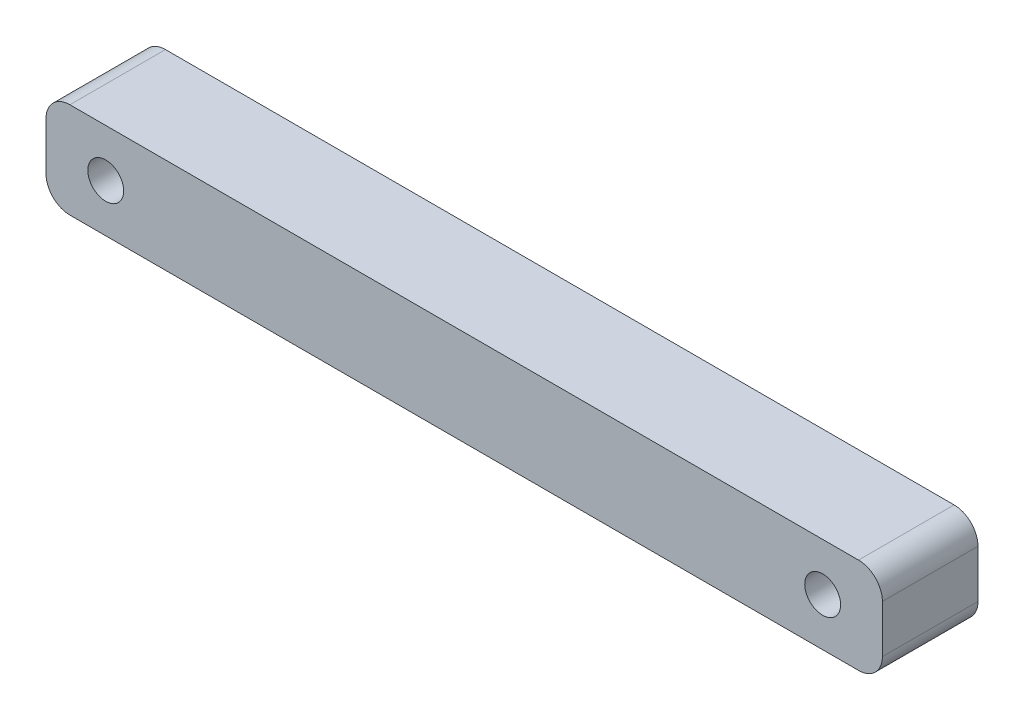
ISO-10303-21;
HEADER;
FILE_DESCRIPTION(('STEP AP214'),'2;1');
FILE_NAME('part.step','',(''),(''),'','','');
FILE_SCHEMA(('AUTOMOTIVE_DESIGN { 1 0 10303 214 1 1 1 1 }'));
ENDSEC;
DATA;
#1=APPLICATION_CONTEXT('core data for automotive mechanical design processes');
#2=APPLICATION_PROTOCOL_DEFINITION('international standard','automotive_design',2000,#1);
#3=PRODUCT_CONTEXT('',#1,'mechanical');
#4=PRODUCT('Part','Part','',(#3));
#5=PRODUCT_RELATED_PRODUCT_CATEGORY('part','',(#4));
#6=PRODUCT_DEFINITION_FORMATION('','',#4);
#7=PRODUCT_DEFINITION_CONTEXT('part definition',#1,'design');
#8=PRODUCT_DEFINITION('design','',#6,#7);
#9=PRODUCT_DEFINITION_SHAPE('','',#8);
#10=(LENGTH_UNIT() NAMED_UNIT(*) SI_UNIT(.MILLI.,.METRE.));
#11=(NAMED_UNIT(*) PLANE_ANGLE_UNIT() SI_UNIT($,.RADIAN.));
#12=(NAMED_UNIT(*) SI_UNIT($,.STERADIAN.) SOLID_ANGLE_UNIT());
#13=UNCERTAINTY_MEASURE_WITH_UNIT(LENGTH_MEASURE(1.E-05),#10,'distance_accuracy_value','');
#14=(GEOMETRIC_REPRESENTATION_CONTEXT(3) GLOBAL_UNCERTAINTY_ASSIGNED_CONTEXT((#13)) GLOBAL_UNIT_ASSIGNED_CONTEXT((#10,
#11,#12)) REPRESENTATION_CONTEXT('',''));
#15=CARTESIAN_POINT('',(0.,0.,0.));
#16=DIRECTION('',(0.,0.,1.));
#17=DIRECTION('',(1.,0.,0.));
#18=AXIS2_PLACEMENT_3D('',#15,#16,#17);
#19=CARTESIAN_POINT('',(0.,0.,8.));
#20=DIRECTION('',(0.,0.,1.));
#21=DIRECTION('',(1.,0.,0.));
#22=AXIS2_PLACEMENT_3D('',#19,#20,#21);
#23=PLANE('',#22);
#24=CARTESIAN_POINT('',(5.,-4.,8.));
#25=DIRECTION('',(0.,0.,1.));
#26=DIRECTION('',(1.,0.,0.));
#27=AXIS2_PLACEMENT_3D('',#24,#25,#26);
#28=CIRCLE('',#27,1.5);
#29=CARTESIAN_POINT('',(6.5,-4.,8.));
#30=VERTEX_POINT('',#29);
#31=EDGE_CURVE('E138',#30,#30,#28,.T.);
#32=ORIENTED_EDGE('',*,*,#31,.F.);
#33=EDGE_LOOP('',(#32));
#34=FACE_BOUND('',#33,.T.);
#35=DIRECTION('',(0.,-1.,0.));
#36=VECTOR('',#35,1.);
#37=CARTESIAN_POINT('',(0.,0.,8.));
#38=LINE('',#37,#36);
#39=CARTESIAN_POINT('',(0.,-2.,8.));
#40=VERTEX_POINT('',#39);
#41=CARTESIAN_POINT('',(0.,-6.,8.));
#42=VERTEX_POINT('',#41);
#43=EDGE_CURVE('E143',#40,#42,#38,.T.);
#44=ORIENTED_EDGE('',*,*,#43,.T.);
#45=CARTESIAN_POINT('',(2.,-6.,8.));
#46=DIRECTION('',(0.,0.,1.));
#47=DIRECTION('',(1.,0.,0.));
#48=AXIS2_PLACEMENT_3D('',#45,#46,#47);
#49=CIRCLE('',#48,2.);
#50=CARTESIAN_POINT('',(2.,-8.,8.));
#51=VERTEX_POINT('',#50);
#52=EDGE_CURVE('E158',#42,#51,#49,.T.);
#53=ORIENTED_EDGE('',*,*,#52,.T.);
#54=DIRECTION('',(1.,0.,0.));
#55=VECTOR('',#54,1.);
#56=CARTESIAN_POINT('',(0.,-8.,8.));
#57=LINE('',#56,#55);
#58=CARTESIAN_POINT('',(68.,-8.,8.));
#59=VERTEX_POINT('',#58);
#60=EDGE_CURVE('E125',#51,#59,#57,.T.);
#61=ORIENTED_EDGE('',*,*,#60,.T.);
#62=CARTESIAN_POINT('',(68.,-6.,8.));
#63=DIRECTION('',(0.,0.,1.));
#64=DIRECTION('',(1.,0.,0.));
#65=AXIS2_PLACEMENT_3D('',#62,#63,#64);
#66=CIRCLE('',#65,2.);
#67=CARTESIAN_POINT('',(70.,-6.,8.));
#68=VERTEX_POINT('',#67);
#69=EDGE_CURVE('E153',#59,#68,#66,.T.);
#70=ORIENTED_EDGE('',*,*,#69,.T.);
#71=DIRECTION('',(0.,1.,0.));
#72=VECTOR('',#71,1.);
#73=CARTESIAN_POINT('',(70.,0.,8.));
#74=LINE('',#73,#72);
#75=CARTESIAN_POINT('',(70.,-2.,8.));
#76=VERTEX_POINT('',#75);
#77=EDGE_CURVE('E169',#68,#76,#74,.T.);
#78=ORIENTED_EDGE('',*,*,#77,.T.);
#79=CARTESIAN_POINT('',(68.,-2.,8.));
#80=DIRECTION('',(0.,0.,1.));
#81=DIRECTION('',(1.,0.,0.));
#82=AXIS2_PLACEMENT_3D('',#79,#80,#81);
#83=CIRCLE('',#82,2.);
#84=CARTESIAN_POINT('',(68.,0.,8.));
#85=VERTEX_POINT('',#84);
#86=EDGE_CURVE('E61',#76,#85,#83,.T.);
#87=ORIENTED_EDGE('',*,*,#86,.T.);
#88=DIRECTION('',(-1.,0.,0.));
#89=VECTOR('',#88,1.);
#90=CARTESIAN_POINT('',(0.,0.,8.));
#91=LINE('',#90,#89);
#92=CARTESIAN_POINT('',(2.,0.,8.));
#93=VERTEX_POINT('',#92);
#94=EDGE_CURVE('E144',#85,#93,#91,.T.);
#95=ORIENTED_EDGE('',*,*,#94,.T.);
#96=CARTESIAN_POINT('',(2.,-2.,8.));
#97=DIRECTION('',(0.,0.,1.));
#98=DIRECTION('',(1.,0.,0.));
#99=AXIS2_PLACEMENT_3D('',#96,#97,#98);
#100=CIRCLE('',#99,2.);
#101=EDGE_CURVE('E156',#93,#40,#100,.T.);
#102=ORIENTED_EDGE('',*,*,#101,.T.);
#103=EDGE_LOOP('',(#44,#53,#61,#70,#78,#87,#95,#102));
#104=FACE_BOUND('',#103,.T.);
#105=CARTESIAN_POINT('',(65.,-4.,8.));
#106=DIRECTION('',(0.,0.,1.));
#107=DIRECTION('',(-1.,0.,0.));
#108=AXIS2_PLACEMENT_3D('',#105,#106,#107);
#109=CIRCLE('',#108,1.5);
#110=CARTESIAN_POINT('',(63.5,-4.,8.));
#111=VERTEX_POINT('',#110);
#112=EDGE_CURVE('E186',#111,#111,#109,.T.);
#113=ORIENTED_EDGE('',*,*,#112,.F.);
#114=EDGE_LOOP('',(#113));
#115=FACE_BOUND('',#114,.T.);
#116=ADVANCED_FACE('F39',(#34,#104,#115),#23,.T.);
#117=CARTESIAN_POINT('',(0.,0.,0.));
#118=DIRECTION('',(0.,0.,1.));
#119=DIRECTION('',(1.,0.,0.));
#120=AXIS2_PLACEMENT_3D('',#117,#118,#119);
#121=PLANE('',#120);
#122=DIRECTION('',(1.,0.,0.));
#123=VECTOR('',#122,1.);
#124=CARTESIAN_POINT('',(0.,-8.,0.));
#125=LINE('',#124,#123);
#126=CARTESIAN_POINT('',(2.,-8.,0.));
#127=VERTEX_POINT('',#126);
#128=CARTESIAN_POINT('',(68.,-8.,0.));
#129=VERTEX_POINT('',#128);
#130=EDGE_CURVE('E122',#127,#129,#125,.T.);
#131=ORIENTED_EDGE('',*,*,#130,.F.);
#132=CARTESIAN_POINT('',(2.,-6.,0.));
#133=DIRECTION('',(0.,0.,1.));
#134=DIRECTION('',(1.,0.,0.));
#135=AXIS2_PLACEMENT_3D('',#132,#133,#134);
#136=CIRCLE('',#135,2.);
#137=CARTESIAN_POINT('',(0.,-6.,0.));
#138=VERTEX_POINT('',#137);
#139=EDGE_CURVE('E105',#127,#138,#136,.F.);
#140=ORIENTED_EDGE('',*,*,#139,.T.);
#141=DIRECTION('',(0.,-1.,0.));
#142=VECTOR('',#141,1.);
#143=CARTESIAN_POINT('',(0.,0.,0.));
#144=LINE('',#143,#142);
#145=CARTESIAN_POINT('',(0.,-2.,0.));
#146=VERTEX_POINT('',#145);
#147=EDGE_CURVE('E133',#146,#138,#144,.T.);
#148=ORIENTED_EDGE('',*,*,#147,.F.);
#149=CARTESIAN_POINT('',(2.,-2.,0.));
#150=DIRECTION('',(0.,0.,1.));
#151=DIRECTION('',(1.,0.,0.));
#152=AXIS2_PLACEMENT_3D('',#149,#150,#151);
#153=CIRCLE('',#152,2.);
#154=CARTESIAN_POINT('',(2.,0.,0.));
#155=VERTEX_POINT('',#154);
#156=EDGE_CURVE('E116',#146,#155,#153,.F.);
#157=ORIENTED_EDGE('',*,*,#156,.T.);
#158=DIRECTION('',(-1.,0.,0.));
#159=VECTOR('',#158,1.);
#160=CARTESIAN_POINT('',(0.,0.,0.));
#161=LINE('',#160,#159);
#162=CARTESIAN_POINT('',(68.,0.,0.));
#163=VERTEX_POINT('',#162);
#164=EDGE_CURVE('E136',#163,#155,#161,.T.);
#165=ORIENTED_EDGE('',*,*,#164,.F.);
#166=CARTESIAN_POINT('',(68.,-2.,0.));
#167=DIRECTION('',(0.,0.,1.));
#168=DIRECTION('',(1.,0.,0.));
#169=AXIS2_PLACEMENT_3D('',#166,#167,#168);
#170=CIRCLE('',#169,2.);
#171=CARTESIAN_POINT('',(70.,-2.,0.));
#172=VERTEX_POINT('',#171);
#173=EDGE_CURVE('E147',#163,#172,#170,.F.);
#174=ORIENTED_EDGE('',*,*,#173,.T.);
#175=DIRECTION('',(0.,1.,0.));
#176=VECTOR('',#175,1.);
#177=CARTESIAN_POINT('',(70.,0.,0.));
#178=LINE('',#177,#176);
#179=CARTESIAN_POINT('',(70.,-6.,0.));
#180=VERTEX_POINT('',#179);
#181=EDGE_CURVE('E132',#180,#172,#178,.T.);
#182=ORIENTED_EDGE('',*,*,#181,.F.);
#183=CARTESIAN_POINT('',(68.,-6.,0.));
#184=DIRECTION('',(0.,0.,1.));
#185=DIRECTION('',(1.,0.,0.));
#186=AXIS2_PLACEMENT_3D('',#183,#184,#185);
#187=CIRCLE('',#186,2.);
#188=EDGE_CURVE('E126',#180,#129,#187,.F.);
#189=ORIENTED_EDGE('',*,*,#188,.T.);
#190=EDGE_LOOP('',(#131,#140,#148,#157,#165,#174,#182,#189));
#191=FACE_BOUND('',#190,.T.);
#192=CARTESIAN_POINT('',(5.,-4.,0.));
#193=DIRECTION('',(0.,0.,1.));
#194=DIRECTION('',(1.,0.,0.));
#195=AXIS2_PLACEMENT_3D('',#192,#193,#194);
#196=CIRCLE('',#195,1.5);
#197=CARTESIAN_POINT('',(6.5,-4.,0.));
#198=VERTEX_POINT('',#197);
#199=EDGE_CURVE('E183',#198,#198,#196,.T.);
#200=ORIENTED_EDGE('',*,*,#199,.T.);
#201=EDGE_LOOP('',(#200));
#202=FACE_BOUND('',#201,.T.);
#203=CARTESIAN_POINT('',(65.,-4.,0.));
#204=DIRECTION('',(0.,0.,1.));
#205=DIRECTION('',(-1.,0.,0.));
#206=AXIS2_PLACEMENT_3D('',#203,#204,#205);
#207=CIRCLE('',#206,1.5);
#208=CARTESIAN_POINT('',(63.5,-4.,0.));
#209=VERTEX_POINT('',#208);
#210=EDGE_CURVE('E189',#209,#209,#207,.T.);
#211=ORIENTED_EDGE('',*,*,#210,.T.);
#212=EDGE_LOOP('',(#211));
#213=FACE_BOUND('',#212,.T.);
#214=ADVANCED_FACE('F129',(#191,#202,#213),#121,.F.);
#215=CARTESIAN_POINT('',(0.,0.,8.));
#216=DIRECTION('',(1.,0.,0.));
#217=DIRECTION('',(0.,0.,-1.));
#218=AXIS2_PLACEMENT_3D('',#215,#216,#217);
#219=PLANE('',#218);
#220=ORIENTED_EDGE('',*,*,#147,.T.);
#221=DIRECTION('',(0.,0.,-1.));
#222=VECTOR('',#221,1.);
#223=CARTESIAN_POINT('',(0.,-6.,8.));
#224=LINE('',#223,#222);
#225=EDGE_CURVE('E110',#138,#42,#224,.F.);
#226=ORIENTED_EDGE('',*,*,#225,.T.);
#227=ORIENTED_EDGE('',*,*,#43,.F.);
#228=DIRECTION('',(0.,0.,-1.));
#229=VECTOR('',#228,1.);
#230=CARTESIAN_POINT('',(0.,-2.,8.));
#231=LINE('',#230,#229);
#232=EDGE_CURVE('E115',#40,#146,#231,.T.);
#233=ORIENTED_EDGE('',*,*,#232,.T.);
#234=EDGE_LOOP('',(#220,#226,#227,#233));
#235=FACE_BOUND('',#234,.T.);
#236=ADVANCED_FACE('F205',(#235),#219,.F.);
#237=CARTESIAN_POINT('',(0.,-8.,8.));
#238=DIRECTION('',(0.,1.,0.));
#239=DIRECTION('',(0.,0.,1.));
#240=AXIS2_PLACEMENT_3D('',#237,#238,#239);
#241=PLANE('',#240);
#242=ORIENTED_EDGE('',*,*,#60,.F.);
#243=DIRECTION('',(0.,0.,-1.));
#244=VECTOR('',#243,1.);
#245=CARTESIAN_POINT('',(2.,-8.,8.));
#246=LINE('',#245,#244);
#247=EDGE_CURVE('E109',#51,#127,#246,.T.);
#248=ORIENTED_EDGE('',*,*,#247,.T.);
#249=ORIENTED_EDGE('',*,*,#130,.T.);
#250=DIRECTION('',(0.,0.,-1.));
#251=VECTOR('',#250,1.);
#252=CARTESIAN_POINT('',(68.,-8.,8.));
#253=LINE('',#252,#251);
#254=EDGE_CURVE('E127',#129,#59,#253,.F.);
#255=ORIENTED_EDGE('',*,*,#254,.T.);
#256=EDGE_LOOP('',(#242,#248,#249,#255));
#257=FACE_BOUND('',#256,.T.);
#258=ADVANCED_FACE('F121',(#257),#241,.F.);
#259=CARTESIAN_POINT('',(70.,0.,8.));
#260=DIRECTION('',(-1.,0.,0.));
#261=DIRECTION('',(0.,0.,1.));
#262=AXIS2_PLACEMENT_3D('',#259,#260,#261);
#263=PLANE('',#262);
#264=ORIENTED_EDGE('',*,*,#181,.T.);
#265=DIRECTION('',(0.,0.,-1.));
#266=VECTOR('',#265,1.);
#267=CARTESIAN_POINT('',(70.,-2.,8.));
#268=LINE('',#267,#266);
#269=EDGE_CURVE('E11',#172,#76,#268,.F.);
#270=ORIENTED_EDGE('',*,*,#269,.T.);
#271=ORIENTED_EDGE('',*,*,#77,.F.);
#272=DIRECTION('',(0.,0.,-1.));
#273=VECTOR('',#272,1.);
#274=CARTESIAN_POINT('',(70.,-6.,8.));
#275=LINE('',#274,#273);
#276=EDGE_CURVE('E47',#68,#180,#275,.T.);
#277=ORIENTED_EDGE('',*,*,#276,.T.);
#278=EDGE_LOOP('',(#264,#270,#271,#277));
#279=FACE_BOUND('',#278,.T.);
#280=ADVANCED_FACE('F167',(#279),#263,.F.);
#281=CARTESIAN_POINT('',(0.,0.,8.));
#282=DIRECTION('',(0.,-1.,0.));
#283=DIRECTION('',(0.,0.,-1.));
#284=AXIS2_PLACEMENT_3D('',#281,#282,#283);
#285=PLANE('',#284);
#286=ORIENTED_EDGE('',*,*,#164,.T.);
#287=DIRECTION('',(0.,0.,-1.));
#288=VECTOR('',#287,1.);
#289=CARTESIAN_POINT('',(2.,0.,8.));
#290=LINE('',#289,#288);
#291=EDGE_CURVE('E54',#155,#93,#290,.F.);
#292=ORIENTED_EDGE('',*,*,#291,.T.);
#293=ORIENTED_EDGE('',*,*,#94,.F.);
#294=DIRECTION('',(0.,0.,-1.));
#295=VECTOR('',#294,1.);
#296=CARTESIAN_POINT('',(68.,0.,8.));
#297=LINE('',#296,#295);
#298=EDGE_CURVE('E160',#85,#163,#297,.T.);
#299=ORIENTED_EDGE('',*,*,#298,.T.);
#300=EDGE_LOOP('',(#286,#292,#293,#299));
#301=FACE_BOUND('',#300,.T.);
#302=ADVANCED_FACE('F176',(#301),#285,.F.);
#303=CARTESIAN_POINT('',(5.,-4.,8.));
#304=DIRECTION('',(0.,0.,-1.));
#305=DIRECTION('',(-1.,0.,0.));
#306=AXIS2_PLACEMENT_3D('',#303,#304,#305);
#307=CYLINDRICAL_SURFACE('',#306,1.5);
#308=ORIENTED_EDGE('',*,*,#31,.T.);
#309=EDGE_LOOP('',(#308));
#310=FACE_BOUND('',#309,.T.);
#311=ORIENTED_EDGE('',*,*,#199,.F.);
#312=EDGE_LOOP('',(#311));
#313=FACE_BOUND('',#312,.T.);
#314=ADVANCED_FACE('F209',(#310,#313),#307,.F.);
#315=CARTESIAN_POINT('',(65.,-4.,8.));
#316=DIRECTION('',(0.,0.,-1.));
#317=DIRECTION('',(-1.,0.,0.));
#318=AXIS2_PLACEMENT_3D('',#315,#316,#317);
#319=CYLINDRICAL_SURFACE('',#318,1.5);
#320=ORIENTED_EDGE('',*,*,#112,.T.);
#321=EDGE_LOOP('',(#320));
#322=FACE_BOUND('',#321,.T.);
#323=ORIENTED_EDGE('',*,*,#210,.F.);
#324=EDGE_LOOP('',(#323));
#325=FACE_BOUND('',#324,.T.);
#326=ADVANCED_FACE('F195',(#322,#325),#319,.F.);
#327=CARTESIAN_POINT('',(2.,-6.,8.));
#328=DIRECTION('',(0.,0.,-1.));
#329=DIRECTION('',(-1.,0.,0.));
#330=AXIS2_PLACEMENT_3D('',#327,#328,#329);
#331=CYLINDRICAL_SURFACE('',#330,2.);
#332=ORIENTED_EDGE('',*,*,#52,.F.);
#333=ORIENTED_EDGE('',*,*,#225,.F.);
#334=ORIENTED_EDGE('',*,*,#139,.F.);
#335=ORIENTED_EDGE('',*,*,#247,.F.);
#336=EDGE_LOOP('',(#332,#333,#334,#335));
#337=FACE_BOUND('',#336,.T.);
#338=ADVANCED_FACE('F108',(#337),#331,.T.);
#339=CARTESIAN_POINT('',(2.,-2.,8.));
#340=DIRECTION('',(0.,0.,-1.));
#341=DIRECTION('',(-1.,0.,0.));
#342=AXIS2_PLACEMENT_3D('',#339,#340,#341);
#343=CYLINDRICAL_SURFACE('',#342,2.);
#344=ORIENTED_EDGE('',*,*,#101,.F.);
#345=ORIENTED_EDGE('',*,*,#291,.F.);
#346=ORIENTED_EDGE('',*,*,#156,.F.);
#347=ORIENTED_EDGE('',*,*,#232,.F.);
#348=EDGE_LOOP('',(#344,#345,#346,#347));
#349=FACE_BOUND('',#348,.T.);
#350=ADVANCED_FACE('F223',(#349),#343,.T.);
#351=CARTESIAN_POINT('',(68.,-2.,8.));
#352=DIRECTION('',(0.,0.,-1.));
#353=DIRECTION('',(-1.,0.,0.));
#354=AXIS2_PLACEMENT_3D('',#351,#352,#353);
#355=CYLINDRICAL_SURFACE('',#354,2.);
#356=ORIENTED_EDGE('',*,*,#86,.F.);
#357=ORIENTED_EDGE('',*,*,#269,.F.);
#358=ORIENTED_EDGE('',*,*,#173,.F.);
#359=ORIENTED_EDGE('',*,*,#298,.F.);
#360=EDGE_LOOP('',(#356,#357,#358,#359));
#361=FACE_BOUND('',#360,.T.);
#362=ADVANCED_FACE('F175',(#361),#355,.T.);
#363=CARTESIAN_POINT('',(68.,-6.,8.));
#364=DIRECTION('',(0.,0.,-1.));
#365=DIRECTION('',(-1.,0.,0.));
#366=AXIS2_PLACEMENT_3D('',#363,#364,#365);
#367=CYLINDRICAL_SURFACE('',#366,2.);
#368=ORIENTED_EDGE('',*,*,#69,.F.);
#369=ORIENTED_EDGE('',*,*,#254,.F.);
#370=ORIENTED_EDGE('',*,*,#188,.F.);
#371=ORIENTED_EDGE('',*,*,#276,.F.);
#372=EDGE_LOOP('',(#368,#369,#370,#371));
#373=FACE_BOUND('',#372,.T.);
#374=ADVANCED_FACE('F41',(#373),#367,.T.);
#375=CLOSED_SHELL('',(#116,#214,#236,#258,#280,#302,#314,#326,#338,#350,#362,#374));
#376=MANIFOLD_SOLID_BREP('B2',#375);
#377=ADVANCED_BREP_SHAPE_REPRESENTATION('',(#18,#376),#14);
#378=SHAPE_DEFINITION_REPRESENTATION(#9,#377);
ENDSEC;
END-ISO-10303-21;
